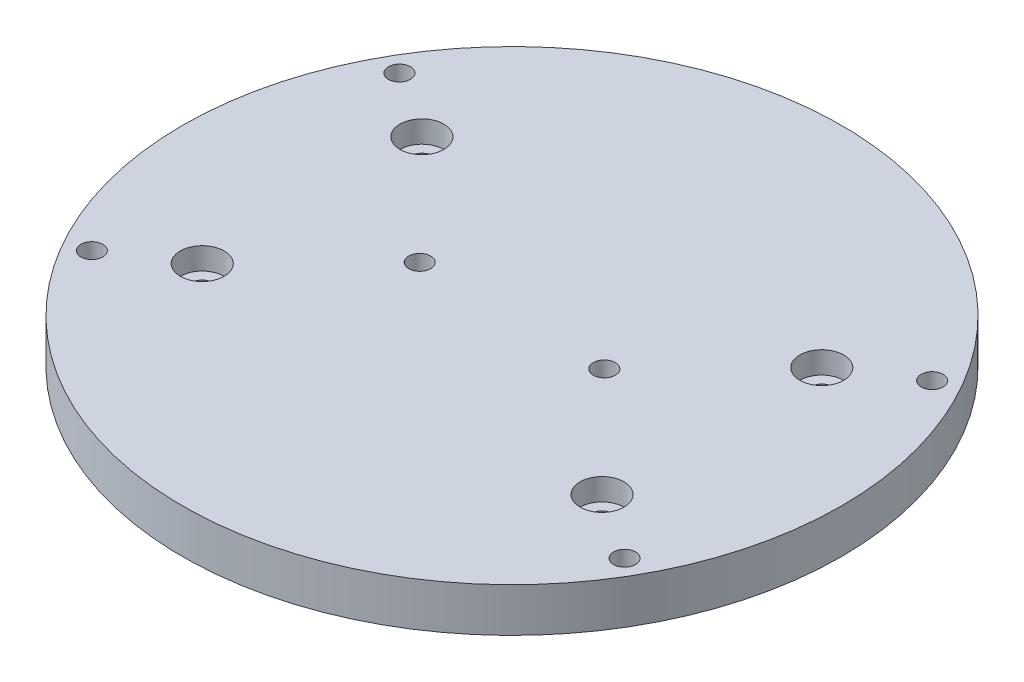
ISO-10303-21;
HEADER;
FILE_DESCRIPTION(('STEP AP214'),'2;1');
FILE_NAME('part.step','',(''),(''),'','','');
FILE_SCHEMA(('AUTOMOTIVE_DESIGN { 1 0 10303 214 1 1 1 1 }'));
ENDSEC;
DATA;
#1=APPLICATION_CONTEXT('core data for automotive mechanical design processes');
#2=APPLICATION_PROTOCOL_DEFINITION('international standard','automotive_design',2000,#1);
#3=PRODUCT_CONTEXT('',#1,'mechanical');
#4=PRODUCT('Part','Part','',(#3));
#5=PRODUCT_RELATED_PRODUCT_CATEGORY('part','',(#4));
#6=PRODUCT_DEFINITION_FORMATION('','',#4);
#7=PRODUCT_DEFINITION_CONTEXT('part definition',#1,'design');
#8=PRODUCT_DEFINITION('design','',#6,#7);
#9=PRODUCT_DEFINITION_SHAPE('','',#8);
#10=(LENGTH_UNIT() NAMED_UNIT(*) SI_UNIT(.MILLI.,.METRE.));
#11=(NAMED_UNIT(*) PLANE_ANGLE_UNIT() SI_UNIT($,.RADIAN.));
#12=(NAMED_UNIT(*) SI_UNIT($,.STERADIAN.) SOLID_ANGLE_UNIT());
#13=UNCERTAINTY_MEASURE_WITH_UNIT(LENGTH_MEASURE(1.E-05),#10,'distance_accuracy_value','');
#14=(GEOMETRIC_REPRESENTATION_CONTEXT(3) GLOBAL_UNCERTAINTY_ASSIGNED_CONTEXT((#13)) GLOBAL_UNIT_ASSIGNED_CONTEXT((#10,
#11,#12)) REPRESENTATION_CONTEXT('',''));
#15=CARTESIAN_POINT('',(0.,0.,0.));
#16=DIRECTION('',(0.,0.,1.));
#17=DIRECTION('',(1.,0.,0.));
#18=AXIS2_PLACEMENT_3D('',#15,#16,#17);
#19=CARTESIAN_POINT('',(45.5,330.,75.));
#20=DIRECTION('',(0.,-1.,0.));
#21=DIRECTION('',(1.,0.,0.));
#22=AXIS2_PLACEMENT_3D('',#19,#20,#21);
#23=CYLINDRICAL_SURFACE('',#22,2.5);
#24=CARTESIAN_POINT('',(45.5,320.,75.));
#25=DIRECTION('',(0.,-1.,0.));
#26=DIRECTION('',(1.,0.,0.));
#27=AXIS2_PLACEMENT_3D('',#24,#25,#26);
#28=CIRCLE('',#27,2.5);
#29=CARTESIAN_POINT('',(48.,320.,75.));
#30=VERTEX_POINT('',#29);
#31=EDGE_CURVE('E467',#30,#30,#28,.T.);
#32=ORIENTED_EDGE('',*,*,#31,.T.);
#33=EDGE_LOOP('',(#32));
#34=FACE_BOUND('',#33,.T.);
#35=CARTESIAN_POINT('',(45.5,325.,75.));
#36=DIRECTION('',(0.,1.,0.));
#37=DIRECTION('',(-1.,0.,0.));
#38=AXIS2_PLACEMENT_3D('',#35,#36,#37);
#39=CIRCLE('',#38,2.5);
#40=CARTESIAN_POINT('',(43.,325.,75.));
#41=VERTEX_POINT('',#40);
#42=EDGE_CURVE('E402',#41,#41,#39,.F.);
#43=ORIENTED_EDGE('',*,*,#42,.F.);
#44=EDGE_LOOP('',(#43));
#45=FACE_BOUND('',#44,.T.);
#46=ADVANCED_FACE('F398',(#34,#45),#23,.F.);
#47=CARTESIAN_POINT('',(-45.5000000000001,330.,25.));
#48=DIRECTION('',(0.,-1.,0.));
#49=DIRECTION('',(1.,0.,0.));
#50=AXIS2_PLACEMENT_3D('',#47,#48,#49);
#51=CYLINDRICAL_SURFACE('',#50,2.5);
#52=CARTESIAN_POINT('',(-45.5000000000001,320.,25.));
#53=DIRECTION('',(0.,-1.,0.));
#54=DIRECTION('',(-1.,0.,0.));
#55=AXIS2_PLACEMENT_3D('',#52,#53,#54);
#56=CIRCLE('',#55,2.5);
#57=CARTESIAN_POINT('',(-48.0000000000001,320.,25.));
#58=VERTEX_POINT('',#57);
#59=EDGE_CURVE('E470',#58,#58,#56,.T.);
#60=ORIENTED_EDGE('',*,*,#59,.T.);
#61=EDGE_LOOP('',(#60));
#62=FACE_BOUND('',#61,.T.);
#63=CARTESIAN_POINT('',(-45.5000000000001,325.,25.));
#64=DIRECTION('',(0.,1.,0.));
#65=DIRECTION('',(-1.,0.,0.));
#66=AXIS2_PLACEMENT_3D('',#63,#64,#65);
#67=CIRCLE('',#66,2.5);
#68=CARTESIAN_POINT('',(-48.0000000000001,325.,25.));
#69=VERTEX_POINT('',#68);
#70=EDGE_CURVE('E421',#69,#69,#67,.F.);
#71=ORIENTED_EDGE('',*,*,#70,.F.);
#72=EDGE_LOOP('',(#71));
#73=FACE_BOUND('',#72,.T.);
#74=ADVANCED_FACE('F498',(#62,#73),#51,.F.);
#75=CARTESIAN_POINT('',(45.5,330.,25.));
#76=DIRECTION('',(0.,-1.,0.));
#77=DIRECTION('',(1.,0.,0.));
#78=AXIS2_PLACEMENT_3D('',#75,#76,#77);
#79=CYLINDRICAL_SURFACE('',#78,2.5);
#80=CARTESIAN_POINT('',(45.5,320.,25.));
#81=DIRECTION('',(0.,-1.,0.));
#82=DIRECTION('',(1.,0.,0.));
#83=AXIS2_PLACEMENT_3D('',#80,#81,#82);
#84=CIRCLE('',#83,2.5);
#85=CARTESIAN_POINT('',(48.,320.,25.));
#86=VERTEX_POINT('',#85);
#87=EDGE_CURVE('E442',#86,#86,#84,.T.);
#88=ORIENTED_EDGE('',*,*,#87,.T.);
#89=EDGE_LOOP('',(#88));
#90=FACE_BOUND('',#89,.T.);
#91=CARTESIAN_POINT('',(45.5,325.,25.));
#92=DIRECTION('',(0.,1.,0.));
#93=DIRECTION('',(-1.,0.,0.));
#94=AXIS2_PLACEMENT_3D('',#91,#92,#93);
#95=CIRCLE('',#94,2.5);
#96=CARTESIAN_POINT('',(43.,325.,25.));
#97=VERTEX_POINT('',#96);
#98=EDGE_CURVE('E418',#97,#97,#95,.F.);
#99=ORIENTED_EDGE('',*,*,#98,.F.);
#100=EDGE_LOOP('',(#99));
#101=FACE_BOUND('',#100,.T.);
#102=ADVANCED_FACE('F504',(#90,#101),#79,.F.);
#103=CARTESIAN_POINT('',(-45.5000000000001,330.,75.));
#104=DIRECTION('',(0.,-1.,0.));
#105=DIRECTION('',(1.,0.,0.));
#106=AXIS2_PLACEMENT_3D('',#103,#104,#105);
#107=CYLINDRICAL_SURFACE('',#106,2.5);
#108=CARTESIAN_POINT('',(-45.5000000000001,320.,75.));
#109=DIRECTION('',(0.,-1.,0.));
#110=DIRECTION('',(-1.,0.,0.));
#111=AXIS2_PLACEMENT_3D('',#108,#109,#110);
#112=CIRCLE('',#111,2.5);
#113=CARTESIAN_POINT('',(-48.0000000000001,320.,75.));
#114=VERTEX_POINT('',#113);
#115=EDGE_CURVE('E439',#114,#114,#112,.T.);
#116=ORIENTED_EDGE('',*,*,#115,.T.);
#117=EDGE_LOOP('',(#116));
#118=FACE_BOUND('',#117,.T.);
#119=CARTESIAN_POINT('',(-45.5000000000001,325.,75.));
#120=DIRECTION('',(0.,1.,0.));
#121=DIRECTION('',(-1.,0.,0.));
#122=AXIS2_PLACEMENT_3D('',#119,#120,#121);
#123=CIRCLE('',#122,2.5);
#124=CARTESIAN_POINT('',(-48.0000000000001,325.,75.));
#125=VERTEX_POINT('',#124);
#126=EDGE_CURVE('E415',#125,#125,#123,.F.);
#127=ORIENTED_EDGE('',*,*,#126,.F.);
#128=EDGE_LOOP('',(#127));
#129=FACE_BOUND('',#128,.T.);
#130=ADVANCED_FACE('F485',(#118,#129),#107,.F.);
#131=CARTESIAN_POINT('',(0.,320.,50.));
#132=DIRECTION('',(0.,1.,0.));
#133=DIRECTION('',(-1.,0.,0.));
#134=AXIS2_PLACEMENT_3D('',#131,#132,#133);
#135=PLANE('',#134);
#136=CARTESIAN_POINT('',(-60.6217782649106,320.,14.9999999999998));
#137=DIRECTION('',(0.,-1.,0.));
#138=DIRECTION('',(1.,0.,0.));
#139=AXIS2_PLACEMENT_3D('',#136,#137,#138);
#140=CIRCLE('',#139,2.50000000000001);
#141=CARTESIAN_POINT('',(-58.1217782649105,320.,14.9999999999998));
#142=VERTEX_POINT('',#141);
#143=EDGE_CURVE('E435',#142,#142,#140,.T.);
#144=ORIENTED_EDGE('',*,*,#143,.F.);
#145=EDGE_LOOP('',(#144));
#146=FACE_BOUND('',#145,.T.);
#147=CARTESIAN_POINT('',(60.6217782649107,320.,14.9999999999999));
#148=DIRECTION('',(0.,-1.,0.));
#149=DIRECTION('',(-1.,0.,0.));
#150=AXIS2_PLACEMENT_3D('',#147,#148,#149);
#151=CIRCLE('',#150,2.50000000000002);
#152=CARTESIAN_POINT('',(58.1217782649106,320.,14.9999999999999));
#153=VERTEX_POINT('',#152);
#154=EDGE_CURVE('E452',#153,#153,#151,.T.);
#155=ORIENTED_EDGE('',*,*,#154,.F.);
#156=EDGE_LOOP('',(#155));
#157=FACE_BOUND('',#156,.T.);
#158=CARTESIAN_POINT('',(60.6217782649107,320.,85.0000000000001));
#159=DIRECTION('',(0.,-1.,0.));
#160=DIRECTION('',(1.,0.,0.));
#161=AXIS2_PLACEMENT_3D('',#158,#159,#160);
#162=CIRCLE('',#161,2.50000000000002);
#163=CARTESIAN_POINT('',(63.1217782649107,320.,85.0000000000001));
#164=VERTEX_POINT('',#163);
#165=EDGE_CURVE('E446',#164,#164,#162,.T.);
#166=ORIENTED_EDGE('',*,*,#165,.F.);
#167=EDGE_LOOP('',(#166));
#168=FACE_BOUND('',#167,.T.);
#169=ORIENTED_EDGE('',*,*,#115,.F.);
#170=EDGE_LOOP('',(#169));
#171=FACE_BOUND('',#170,.T.);
#172=ORIENTED_EDGE('',*,*,#87,.F.);
#173=EDGE_LOOP('',(#172));
#174=FACE_BOUND('',#173,.T.);
#175=ORIENTED_EDGE('',*,*,#59,.F.);
#176=EDGE_LOOP('',(#175));
#177=FACE_BOUND('',#176,.T.);
#178=ORIENTED_EDGE('',*,*,#31,.F.);
#179=EDGE_LOOP('',(#178));
#180=FACE_BOUND('',#179,.T.);
#181=CARTESIAN_POINT('',(-21.,320.,50.));
#182=DIRECTION('',(0.,-1.,0.));
#183=DIRECTION('',(1.,0.,0.));
#184=AXIS2_PLACEMENT_3D('',#181,#182,#183);
#185=CIRCLE('',#184,2.5);
#186=CARTESIAN_POINT('',(-18.5,320.,50.));
#187=VERTEX_POINT('',#186);
#188=EDGE_CURVE('E464',#187,#187,#185,.T.);
#189=ORIENTED_EDGE('',*,*,#188,.F.);
#190=EDGE_LOOP('',(#189));
#191=FACE_BOUND('',#190,.T.);
#192=CARTESIAN_POINT('',(-60.6217782649107,320.,85.));
#193=DIRECTION('',(0.,-1.,0.));
#194=DIRECTION('',(-1.,0.,0.));
#195=AXIS2_PLACEMENT_3D('',#192,#193,#194);
#196=CIRCLE('',#195,2.50000000000001);
#197=CARTESIAN_POINT('',(-63.1217782649107,320.,85.));
#198=VERTEX_POINT('',#197);
#199=EDGE_CURVE('E426',#198,#198,#196,.T.);
#200=ORIENTED_EDGE('',*,*,#199,.F.);
#201=EDGE_LOOP('',(#200));
#202=FACE_BOUND('',#201,.T.);
#203=CARTESIAN_POINT('',(21.,320.,50.));
#204=DIRECTION('',(0.,-1.,0.));
#205=DIRECTION('',(1.,0.,0.));
#206=AXIS2_PLACEMENT_3D('',#203,#204,#205);
#207=CIRCLE('',#206,2.5);
#208=CARTESIAN_POINT('',(23.5,320.,50.));
#209=VERTEX_POINT('',#208);
#210=EDGE_CURVE('E463',#209,#209,#207,.T.);
#211=ORIENTED_EDGE('',*,*,#210,.F.);
#212=EDGE_LOOP('',(#211));
#213=FACE_BOUND('',#212,.T.);
#214=CARTESIAN_POINT('',(0.,320.,50.));
#215=DIRECTION('',(0.,1.,0.));
#216=DIRECTION('',(-1.,0.,0.));
#217=AXIS2_PLACEMENT_3D('',#214,#215,#216);
#218=CIRCLE('',#217,75.);
#219=CARTESIAN_POINT('',(-75.,320.,50.));
#220=VERTEX_POINT('',#219);
#221=EDGE_CURVE('E406',#220,#220,#218,.T.);
#222=ORIENTED_EDGE('',*,*,#221,.F.);
#223=EDGE_LOOP('',(#222));
#224=FACE_BOUND('',#223,.T.);
#225=ADVANCED_FACE('F481',(#146,#157,#168,#171,#174,#177,#180,#191,#202,#213,#224),#135,.F.);
#226=CARTESIAN_POINT('',(0.,330.,50.));
#227=DIRECTION('',(0.,-1.,0.));
#228=DIRECTION('',(1.,0.,0.));
#229=AXIS2_PLACEMENT_3D('',#226,#227,#228);
#230=CYLINDRICAL_SURFACE('',#229,75.);
#231=CARTESIAN_POINT('',(0.,330.,50.));
#232=DIRECTION('',(0.,1.,0.));
#233=DIRECTION('',(-1.,0.,0.));
#234=AXIS2_PLACEMENT_3D('',#231,#232,#233);
#235=CIRCLE('',#234,75.);
#236=CARTESIAN_POINT('',(-75.,330.,50.));
#237=VERTEX_POINT('',#236);
#238=EDGE_CURVE('E11',#237,#237,#235,.T.);
#239=ORIENTED_EDGE('',*,*,#238,.F.);
#240=EDGE_LOOP('',(#239));
#241=FACE_BOUND('',#240,.T.);
#242=ORIENTED_EDGE('',*,*,#221,.T.);
#243=EDGE_LOOP('',(#242));
#244=FACE_BOUND('',#243,.T.);
#245=ADVANCED_FACE('F484',(#241,#244),#230,.T.);
#246=CARTESIAN_POINT('',(0.,330.,50.));
#247=DIRECTION('',(0.,1.,0.));
#248=DIRECTION('',(-1.,0.,0.));
#249=AXIS2_PLACEMENT_3D('',#246,#247,#248);
#250=PLANE('',#249);
#251=CARTESIAN_POINT('',(-45.5000000000001,330.,25.));
#252=DIRECTION('',(0.,1.,0.));
#253=DIRECTION('',(-1.,0.,0.));
#254=AXIS2_PLACEMENT_3D('',#251,#252,#253);
#255=CIRCLE('',#254,5.);
#256=CARTESIAN_POINT('',(-50.5000000000001,330.,25.));
#257=VERTEX_POINT('',#256);
#258=EDGE_CURVE('E624',#257,#257,#255,.T.);
#259=ORIENTED_EDGE('',*,*,#258,.F.);
#260=EDGE_LOOP('',(#259));
#261=FACE_BOUND('',#260,.T.);
#262=CARTESIAN_POINT('',(-45.5000000000001,330.,75.));
#263=DIRECTION('',(0.,1.,0.));
#264=DIRECTION('',(-1.,0.,0.));
#265=AXIS2_PLACEMENT_3D('',#262,#263,#264);
#266=CIRCLE('',#265,5.);
#267=CARTESIAN_POINT('',(-50.5000000000001,330.,75.));
#268=VERTEX_POINT('',#267);
#269=EDGE_CURVE('E618',#268,#268,#266,.T.);
#270=ORIENTED_EDGE('',*,*,#269,.F.);
#271=EDGE_LOOP('',(#270));
#272=FACE_BOUND('',#271,.T.);
#273=CARTESIAN_POINT('',(45.5,330.,75.));
#274=DIRECTION('',(0.,1.,0.));
#275=DIRECTION('',(-1.,0.,0.));
#276=AXIS2_PLACEMENT_3D('',#273,#274,#275);
#277=CIRCLE('',#276,5.);
#278=CARTESIAN_POINT('',(40.5,330.,75.));
#279=VERTEX_POINT('',#278);
#280=EDGE_CURVE('E609',#279,#279,#277,.T.);
#281=ORIENTED_EDGE('',*,*,#280,.F.);
#282=EDGE_LOOP('',(#281));
#283=FACE_BOUND('',#282,.T.);
#284=CARTESIAN_POINT('',(45.5,330.,25.));
#285=DIRECTION('',(0.,1.,0.));
#286=DIRECTION('',(-1.,0.,0.));
#287=AXIS2_PLACEMENT_3D('',#284,#285,#286);
#288=CIRCLE('',#287,5.);
#289=CARTESIAN_POINT('',(40.5,330.,25.));
#290=VERTEX_POINT('',#289);
#291=EDGE_CURVE('E608',#290,#290,#288,.T.);
#292=ORIENTED_EDGE('',*,*,#291,.F.);
#293=EDGE_LOOP('',(#292));
#294=FACE_BOUND('',#293,.T.);
#295=CARTESIAN_POINT('',(-60.6217782649106,330.,14.9999999999998));
#296=DIRECTION('',(0.,-1.,0.));
#297=DIRECTION('',(1.,0.,0.));
#298=AXIS2_PLACEMENT_3D('',#295,#296,#297);
#299=CIRCLE('',#298,2.50000000000001);
#300=CARTESIAN_POINT('',(-58.1217782649105,330.,14.9999999999998));
#301=VERTEX_POINT('',#300);
#302=EDGE_CURVE('E455',#301,#301,#299,.T.);
#303=ORIENTED_EDGE('',*,*,#302,.T.);
#304=EDGE_LOOP('',(#303));
#305=FACE_BOUND('',#304,.T.);
#306=CARTESIAN_POINT('',(60.6217782649107,330.,14.9999999999999));
#307=DIRECTION('',(0.,-1.,0.));
#308=DIRECTION('',(-1.,0.,0.));
#309=AXIS2_PLACEMENT_3D('',#306,#307,#308);
#310=CIRCLE('',#309,2.50000000000002);
#311=CARTESIAN_POINT('',(58.1217782649106,330.,14.9999999999999));
#312=VERTEX_POINT('',#311);
#313=EDGE_CURVE('E449',#312,#312,#310,.T.);
#314=ORIENTED_EDGE('',*,*,#313,.T.);
#315=EDGE_LOOP('',(#314));
#316=FACE_BOUND('',#315,.T.);
#317=CARTESIAN_POINT('',(60.6217782649107,330.,85.0000000000001));
#318=DIRECTION('',(0.,-1.,0.));
#319=DIRECTION('',(1.,0.,0.));
#320=AXIS2_PLACEMENT_3D('',#317,#318,#319);
#321=CIRCLE('',#320,2.50000000000002);
#322=CARTESIAN_POINT('',(63.1217782649107,330.,85.0000000000001));
#323=VERTEX_POINT('',#322);
#324=EDGE_CURVE('E443',#323,#323,#321,.T.);
#325=ORIENTED_EDGE('',*,*,#324,.T.);
#326=EDGE_LOOP('',(#325));
#327=FACE_BOUND('',#326,.T.);
#328=CARTESIAN_POINT('',(-21.,330.,50.));
#329=DIRECTION('',(0.,-1.,0.));
#330=DIRECTION('',(1.,0.,0.));
#331=AXIS2_PLACEMENT_3D('',#328,#329,#330);
#332=CIRCLE('',#331,2.5);
#333=CARTESIAN_POINT('',(-18.5,330.,50.));
#334=VERTEX_POINT('',#333);
#335=EDGE_CURVE('E460',#334,#334,#332,.T.);
#336=ORIENTED_EDGE('',*,*,#335,.T.);
#337=EDGE_LOOP('',(#336));
#338=FACE_BOUND('',#337,.T.);
#339=CARTESIAN_POINT('',(-60.6217782649107,330.,85.));
#340=DIRECTION('',(0.,-1.,0.));
#341=DIRECTION('',(-1.,0.,0.));
#342=AXIS2_PLACEMENT_3D('',#339,#340,#341);
#343=CIRCLE('',#342,2.50000000000001);
#344=CARTESIAN_POINT('',(-63.1217782649107,330.,85.));
#345=VERTEX_POINT('',#344);
#346=EDGE_CURVE('E430',#345,#345,#343,.T.);
#347=ORIENTED_EDGE('',*,*,#346,.T.);
#348=EDGE_LOOP('',(#347));
#349=FACE_BOUND('',#348,.T.);
#350=CARTESIAN_POINT('',(21.,330.,50.));
#351=DIRECTION('',(0.,-1.,0.));
#352=DIRECTION('',(1.,0.,0.));
#353=AXIS2_PLACEMENT_3D('',#350,#351,#352);
#354=CIRCLE('',#353,2.5);
#355=CARTESIAN_POINT('',(23.5,330.,50.));
#356=VERTEX_POINT('',#355);
#357=EDGE_CURVE('E411',#356,#356,#354,.T.);
#358=ORIENTED_EDGE('',*,*,#357,.T.);
#359=EDGE_LOOP('',(#358));
#360=FACE_BOUND('',#359,.T.);
#361=ORIENTED_EDGE('',*,*,#238,.T.);
#362=EDGE_LOOP('',(#361));
#363=FACE_BOUND('',#362,.T.);
#364=ADVANCED_FACE('F400',(#261,#272,#283,#294,#305,#316,#327,#338,#349,#360,#363),#250,.T.);
#365=CARTESIAN_POINT('',(21.,330.,50.));
#366=DIRECTION('',(0.,-1.,0.));
#367=DIRECTION('',(1.,0.,0.));
#368=AXIS2_PLACEMENT_3D('',#365,#366,#367);
#369=CYLINDRICAL_SURFACE('',#368,2.5);
#370=ORIENTED_EDGE('',*,*,#357,.F.);
#371=EDGE_LOOP('',(#370));
#372=FACE_BOUND('',#371,.T.);
#373=ORIENTED_EDGE('',*,*,#210,.T.);
#374=EDGE_LOOP('',(#373));
#375=FACE_BOUND('',#374,.T.);
#376=ADVANCED_FACE('F479',(#372,#375),#369,.F.);
#377=CARTESIAN_POINT('',(-60.6217782649107,330.,85.));
#378=DIRECTION('',(0.,-1.,0.));
#379=DIRECTION('',(1.,0.,0.));
#380=AXIS2_PLACEMENT_3D('',#377,#378,#379);
#381=CYLINDRICAL_SURFACE('',#380,2.50000000000001);
#382=ORIENTED_EDGE('',*,*,#346,.F.);
#383=EDGE_LOOP('',(#382));
#384=FACE_BOUND('',#383,.T.);
#385=ORIENTED_EDGE('',*,*,#199,.T.);
#386=EDGE_LOOP('',(#385));
#387=FACE_BOUND('',#386,.T.);
#388=ADVANCED_FACE('F515',(#384,#387),#381,.F.);
#389=CARTESIAN_POINT('',(-21.,330.,50.));
#390=DIRECTION('',(0.,-1.,0.));
#391=DIRECTION('',(1.,0.,0.));
#392=AXIS2_PLACEMENT_3D('',#389,#390,#391);
#393=CYLINDRICAL_SURFACE('',#392,2.5);
#394=ORIENTED_EDGE('',*,*,#335,.F.);
#395=EDGE_LOOP('',(#394));
#396=FACE_BOUND('',#395,.T.);
#397=ORIENTED_EDGE('',*,*,#188,.T.);
#398=EDGE_LOOP('',(#397));
#399=FACE_BOUND('',#398,.T.);
#400=ADVANCED_FACE('F509',(#396,#399),#393,.F.);
#401=CARTESIAN_POINT('',(60.6217782649107,330.,85.0000000000001));
#402=DIRECTION('',(0.,-1.,0.));
#403=DIRECTION('',(1.,0.,0.));
#404=AXIS2_PLACEMENT_3D('',#401,#402,#403);
#405=CYLINDRICAL_SURFACE('',#404,2.50000000000002);
#406=ORIENTED_EDGE('',*,*,#324,.F.);
#407=EDGE_LOOP('',(#406));
#408=FACE_BOUND('',#407,.T.);
#409=ORIENTED_EDGE('',*,*,#165,.T.);
#410=EDGE_LOOP('',(#409));
#411=FACE_BOUND('',#410,.T.);
#412=ADVANCED_FACE('F527',(#408,#411),#405,.F.);
#413=CARTESIAN_POINT('',(60.6217782649107,330.,14.9999999999999));
#414=DIRECTION('',(0.,-1.,0.));
#415=DIRECTION('',(1.,0.,0.));
#416=AXIS2_PLACEMENT_3D('',#413,#414,#415);
#417=CYLINDRICAL_SURFACE('',#416,2.50000000000002);
#418=ORIENTED_EDGE('',*,*,#313,.F.);
#419=EDGE_LOOP('',(#418));
#420=FACE_BOUND('',#419,.T.);
#421=ORIENTED_EDGE('',*,*,#154,.T.);
#422=EDGE_LOOP('',(#421));
#423=FACE_BOUND('',#422,.T.);
#424=ADVANCED_FACE('F539',(#420,#423),#417,.F.);
#425=CARTESIAN_POINT('',(-60.6217782649106,330.,14.9999999999998));
#426=DIRECTION('',(0.,-1.,0.));
#427=DIRECTION('',(1.,0.,0.));
#428=AXIS2_PLACEMENT_3D('',#425,#426,#427);
#429=CYLINDRICAL_SURFACE('',#428,2.50000000000001);
#430=ORIENTED_EDGE('',*,*,#302,.F.);
#431=EDGE_LOOP('',(#430));
#432=FACE_BOUND('',#431,.T.);
#433=ORIENTED_EDGE('',*,*,#143,.T.);
#434=EDGE_LOOP('',(#433));
#435=FACE_BOUND('',#434,.T.);
#436=ADVANCED_FACE('F542',(#432,#435),#429,.F.);
#437=CARTESIAN_POINT('',(-45.5000000000001,325.,75.));
#438=DIRECTION('',(0.,1.,0.));
#439=DIRECTION('',(-1.,0.,0.));
#440=AXIS2_PLACEMENT_3D('',#437,#438,#439);
#441=PLANE('',#440);
#442=CARTESIAN_POINT('',(-45.5000000000001,325.,75.));
#443=DIRECTION('',(0.,1.,0.));
#444=DIRECTION('',(-1.,0.,0.));
#445=AXIS2_PLACEMENT_3D('',#442,#443,#444);
#446=CIRCLE('',#445,5.);
#447=CARTESIAN_POINT('',(-50.5000000000001,325.,75.));
#448=VERTEX_POINT('',#447);
#449=EDGE_CURVE('E613',#448,#448,#446,.T.);
#450=ORIENTED_EDGE('',*,*,#449,.T.);
#451=EDGE_LOOP('',(#450));
#452=FACE_BOUND('',#451,.T.);
#453=ORIENTED_EDGE('',*,*,#126,.T.);
#454=EDGE_LOOP('',(#453));
#455=FACE_BOUND('',#454,.T.);
#456=ADVANCED_FACE('F545',(#452,#455),#441,.T.);
#457=CARTESIAN_POINT('',(-45.5000000000001,325.,75.));
#458=DIRECTION('',(0.,1.,0.));
#459=DIRECTION('',(-1.,0.,0.));
#460=AXIS2_PLACEMENT_3D('',#457,#458,#459);
#461=CYLINDRICAL_SURFACE('',#460,5.);
#462=ORIENTED_EDGE('',*,*,#449,.F.);
#463=EDGE_LOOP('',(#462));
#464=FACE_BOUND('',#463,.T.);
#465=ORIENTED_EDGE('',*,*,#269,.T.);
#466=EDGE_LOOP('',(#465));
#467=FACE_BOUND('',#466,.T.);
#468=ADVANCED_FACE('F550',(#464,#467),#461,.F.);
#469=CARTESIAN_POINT('',(45.5,325.,25.));
#470=DIRECTION('',(0.,1.,0.));
#471=DIRECTION('',(-1.,0.,0.));
#472=AXIS2_PLACEMENT_3D('',#469,#470,#471);
#473=PLANE('',#472);
#474=CARTESIAN_POINT('',(45.5,325.,25.));
#475=DIRECTION('',(0.,1.,0.));
#476=DIRECTION('',(-1.,0.,0.));
#477=AXIS2_PLACEMENT_3D('',#474,#475,#476);
#478=CIRCLE('',#477,5.);
#479=CARTESIAN_POINT('',(40.5,325.,25.));
#480=VERTEX_POINT('',#479);
#481=EDGE_CURVE('E419',#480,#480,#478,.T.);
#482=ORIENTED_EDGE('',*,*,#481,.T.);
#483=EDGE_LOOP('',(#482));
#484=FACE_BOUND('',#483,.T.);
#485=ORIENTED_EDGE('',*,*,#98,.T.);
#486=EDGE_LOOP('',(#485));
#487=FACE_BOUND('',#486,.T.);
#488=ADVANCED_FACE('F576',(#484,#487),#473,.T.);
#489=CARTESIAN_POINT('',(45.5,325.,25.));
#490=DIRECTION('',(0.,1.,0.));
#491=DIRECTION('',(-1.,0.,0.));
#492=AXIS2_PLACEMENT_3D('',#489,#490,#491);
#493=CYLINDRICAL_SURFACE('',#492,5.);
#494=ORIENTED_EDGE('',*,*,#481,.F.);
#495=EDGE_LOOP('',(#494));
#496=FACE_BOUND('',#495,.T.);
#497=ORIENTED_EDGE('',*,*,#291,.T.);
#498=EDGE_LOOP('',(#497));
#499=FACE_BOUND('',#498,.T.);
#500=ADVANCED_FACE('F532',(#496,#499),#493,.F.);
#501=CARTESIAN_POINT('',(-45.5000000000001,325.,25.));
#502=DIRECTION('',(0.,1.,0.));
#503=DIRECTION('',(-1.,0.,0.));
#504=AXIS2_PLACEMENT_3D('',#501,#502,#503);
#505=PLANE('',#504);
#506=CARTESIAN_POINT('',(-45.5000000000001,325.,25.));
#507=DIRECTION('',(0.,1.,0.));
#508=DIRECTION('',(-1.,0.,0.));
#509=AXIS2_PLACEMENT_3D('',#506,#507,#508);
#510=CIRCLE('',#509,5.);
#511=CARTESIAN_POINT('',(-50.5000000000001,325.,25.));
#512=VERTEX_POINT('',#511);
#513=EDGE_CURVE('E621',#512,#512,#510,.T.);
#514=ORIENTED_EDGE('',*,*,#513,.T.);
#515=EDGE_LOOP('',(#514));
#516=FACE_BOUND('',#515,.T.);
#517=ORIENTED_EDGE('',*,*,#70,.T.);
#518=EDGE_LOOP('',(#517));
#519=FACE_BOUND('',#518,.T.);
#520=ADVANCED_FACE('F583',(#516,#519),#505,.T.);
#521=CARTESIAN_POINT('',(-45.5000000000001,325.,25.));
#522=DIRECTION('',(0.,1.,0.));
#523=DIRECTION('',(-1.,0.,0.));
#524=AXIS2_PLACEMENT_3D('',#521,#522,#523);
#525=CYLINDRICAL_SURFACE('',#524,5.);
#526=ORIENTED_EDGE('',*,*,#513,.F.);
#527=EDGE_LOOP('',(#526));
#528=FACE_BOUND('',#527,.T.);
#529=ORIENTED_EDGE('',*,*,#258,.T.);
#530=EDGE_LOOP('',(#529));
#531=FACE_BOUND('',#530,.T.);
#532=ADVANCED_FACE('F589',(#528,#531),#525,.F.);
#533=CARTESIAN_POINT('',(45.5,325.,75.));
#534=DIRECTION('',(0.,1.,0.));
#535=DIRECTION('',(-1.,0.,0.));
#536=AXIS2_PLACEMENT_3D('',#533,#534,#535);
#537=PLANE('',#536);
#538=CARTESIAN_POINT('',(45.5,325.,75.));
#539=DIRECTION('',(0.,1.,0.));
#540=DIRECTION('',(-1.,0.,0.));
#541=AXIS2_PLACEMENT_3D('',#538,#539,#540);
#542=CIRCLE('',#541,5.);
#543=CARTESIAN_POINT('',(40.5,325.,75.));
#544=VERTEX_POINT('',#543);
#545=EDGE_CURVE('E607',#544,#544,#542,.T.);
#546=ORIENTED_EDGE('',*,*,#545,.T.);
#547=EDGE_LOOP('',(#546));
#548=FACE_BOUND('',#547,.T.);
#549=ORIENTED_EDGE('',*,*,#42,.T.);
#550=EDGE_LOOP('',(#549));
#551=FACE_BOUND('',#550,.T.);
#552=ADVANCED_FACE('F592',(#548,#551),#537,.T.);
#553=CARTESIAN_POINT('',(45.5,325.,75.));
#554=DIRECTION('',(0.,1.,0.));
#555=DIRECTION('',(-1.,0.,0.));
#556=AXIS2_PLACEMENT_3D('',#553,#554,#555);
#557=CYLINDRICAL_SURFACE('',#556,5.);
#558=ORIENTED_EDGE('',*,*,#545,.F.);
#559=EDGE_LOOP('',(#558));
#560=FACE_BOUND('',#559,.T.);
#561=ORIENTED_EDGE('',*,*,#280,.T.);
#562=EDGE_LOOP('',(#561));
#563=FACE_BOUND('',#562,.T.);
#564=ADVANCED_FACE('F597',(#560,#563),#557,.F.);
#565=CLOSED_SHELL('',(#46,#74,#102,#130,#225,#245,#364,#376,#388,#400,#412,#424,#436,#456,#468,
#488,#500,#520,#532,#552,#564));
#566=MANIFOLD_SOLID_BREP('B2',#565);
#567=ADVANCED_BREP_SHAPE_REPRESENTATION('',(#18,#566),#14);
#568=SHAPE_DEFINITION_REPRESENTATION(#9,#567);
ENDSEC;
END-ISO-10303-21;
